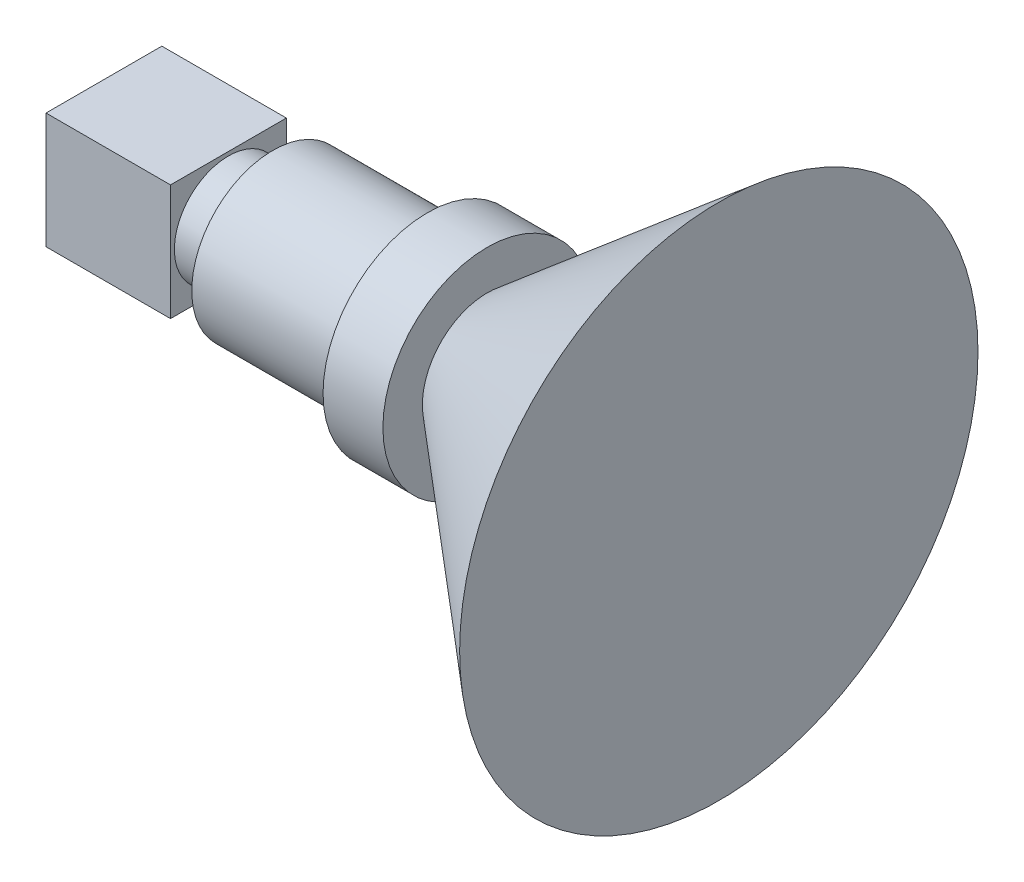
ISO-10303-21;
HEADER;
FILE_DESCRIPTION(('STEP AP214'),'2;1');
FILE_NAME('part.step','',(''),(''),'','','');
FILE_SCHEMA(('AUTOMOTIVE_DESIGN { 1 0 10303 214 1 1 1 1 }'));
ENDSEC;
DATA;
#1=APPLICATION_CONTEXT('core data for automotive mechanical design processes');
#2=APPLICATION_PROTOCOL_DEFINITION('international standard','automotive_design',2000,#1);
#3=PRODUCT_CONTEXT('',#1,'mechanical');
#4=PRODUCT('Part','Part','',(#3));
#5=PRODUCT_RELATED_PRODUCT_CATEGORY('part','',(#4));
#6=PRODUCT_DEFINITION_FORMATION('','',#4);
#7=PRODUCT_DEFINITION_CONTEXT('part definition',#1,'design');
#8=PRODUCT_DEFINITION('design','',#6,#7);
#9=PRODUCT_DEFINITION_SHAPE('','',#8);
#10=(LENGTH_UNIT() NAMED_UNIT(*) SI_UNIT(.MILLI.,.METRE.));
#11=(NAMED_UNIT(*) PLANE_ANGLE_UNIT() SI_UNIT($,.RADIAN.));
#12=(NAMED_UNIT(*) SI_UNIT($,.STERADIAN.) SOLID_ANGLE_UNIT());
#13=UNCERTAINTY_MEASURE_WITH_UNIT(LENGTH_MEASURE(1.E-05),#10,'distance_accuracy_value','');
#14=(GEOMETRIC_REPRESENTATION_CONTEXT(3) GLOBAL_UNCERTAINTY_ASSIGNED_CONTEXT((#13)) GLOBAL_UNIT_ASSIGNED_CONTEXT((#10,
#11,#12)) REPRESENTATION_CONTEXT('',''));
#15=CARTESIAN_POINT('',(0.,0.,0.));
#16=DIRECTION('',(0.,0.,1.));
#17=DIRECTION('',(1.,0.,0.));
#18=AXIS2_PLACEMENT_3D('',#15,#16,#17);
#19=CARTESIAN_POINT('',(16.125,15.,15.));
#20=DIRECTION('',(-1.,0.,0.));
#21=DIRECTION('',(0.,0.,1.));
#22=AXIS2_PLACEMENT_3D('',#19,#20,#21);
#23=PLANE('',#22);
#24=CARTESIAN_POINT('',(16.125,0.,0.));
#25=DIRECTION('',(1.,0.,0.));
#26=DIRECTION('',(0.,0.,-1.));
#27=AXIS2_PLACEMENT_3D('',#24,#25,#26);
#28=CIRCLE('',#27,14.);
#29=CARTESIAN_POINT('',(16.125,0.,-14.));
#30=VERTEX_POINT('',#29);
#31=EDGE_CURVE('E11',#30,#30,#28,.T.);
#32=ORIENTED_EDGE('',*,*,#31,.F.);
#33=EDGE_LOOP('',(#32));
#34=FACE_BOUND('',#33,.T.);
#35=DIRECTION('',(0.,0.,-1.));
#36=VECTOR('',#35,1.);
#37=CARTESIAN_POINT('',(16.125,-15.,15.));
#38=LINE('',#37,#36);
#39=CARTESIAN_POINT('',(16.125,-15.,15.));
#40=VERTEX_POINT('',#39);
#41=CARTESIAN_POINT('',(16.125,-15.,-15.));
#42=VERTEX_POINT('',#41);
#43=EDGE_CURVE('E129',#40,#42,#38,.T.);
#44=ORIENTED_EDGE('',*,*,#43,.T.);
#45=DIRECTION('',(0.,-1.,0.));
#46=VECTOR('',#45,1.);
#47=CARTESIAN_POINT('',(16.125,15.,-15.));
#48=LINE('',#47,#46);
#49=CARTESIAN_POINT('',(16.125,15.,-15.));
#50=VERTEX_POINT('',#49);
#51=EDGE_CURVE('E52',#50,#42,#48,.T.);
#52=ORIENTED_EDGE('',*,*,#51,.F.);
#53=DIRECTION('',(0.,0.,-1.));
#54=VECTOR('',#53,1.);
#55=CARTESIAN_POINT('',(16.125,15.,15.));
#56=LINE('',#55,#54);
#57=CARTESIAN_POINT('',(16.125,15.,15.));
#58=VERTEX_POINT('',#57);
#59=EDGE_CURVE('E131',#58,#50,#56,.T.);
#60=ORIENTED_EDGE('',*,*,#59,.F.);
#61=DIRECTION('',(0.,-1.,0.));
#62=VECTOR('',#61,1.);
#63=CARTESIAN_POINT('',(16.125,15.,15.));
#64=LINE('',#63,#62);
#65=EDGE_CURVE('E137',#58,#40,#64,.T.);
#66=ORIENTED_EDGE('',*,*,#65,.T.);
#67=EDGE_LOOP('',(#44,#52,#60,#66));
#68=FACE_BOUND('',#67,.T.);
#69=ADVANCED_FACE('F43',(#34,#68),#23,.F.);
#70=CARTESIAN_POINT('',(-16.125,15.,-15.));
#71=DIRECTION('',(0.,0.,1.));
#72=DIRECTION('',(1.,0.,0.));
#73=AXIS2_PLACEMENT_3D('',#70,#71,#72);
#74=PLANE('',#73);
#75=DIRECTION('',(-1.,0.,0.));
#76=VECTOR('',#75,1.);
#77=CARTESIAN_POINT('',(-16.125,-15.,-15.));
#78=LINE('',#77,#76);
#79=CARTESIAN_POINT('',(-16.125,-15.,-15.));
#80=VERTEX_POINT('',#79);
#81=EDGE_CURVE('E140',#42,#80,#78,.T.);
#82=ORIENTED_EDGE('',*,*,#81,.T.);
#83=DIRECTION('',(0.,-1.,0.));
#84=VECTOR('',#83,1.);
#85=CARTESIAN_POINT('',(-16.125,15.,-15.));
#86=LINE('',#85,#84);
#87=CARTESIAN_POINT('',(-16.125,15.,-15.));
#88=VERTEX_POINT('',#87);
#89=EDGE_CURVE('E147',#88,#80,#86,.T.);
#90=ORIENTED_EDGE('',*,*,#89,.F.);
#91=DIRECTION('',(-1.,0.,0.));
#92=VECTOR('',#91,1.);
#93=CARTESIAN_POINT('',(-16.125,15.,-15.));
#94=LINE('',#93,#92);
#95=EDGE_CURVE('E93',#50,#88,#94,.T.);
#96=ORIENTED_EDGE('',*,*,#95,.F.);
#97=ORIENTED_EDGE('',*,*,#51,.T.);
#98=EDGE_LOOP('',(#82,#90,#96,#97));
#99=FACE_BOUND('',#98,.T.);
#100=ADVANCED_FACE('F149',(#99),#74,.F.);
#101=CARTESIAN_POINT('',(-16.125,15.,15.));
#102=DIRECTION('',(1.,0.,0.));
#103=DIRECTION('',(0.,0.,-1.));
#104=AXIS2_PLACEMENT_3D('',#101,#102,#103);
#105=PLANE('',#104);
#106=DIRECTION('',(0.,0.,1.));
#107=VECTOR('',#106,1.);
#108=CARTESIAN_POINT('',(-16.125,-15.,15.));
#109=LINE('',#108,#107);
#110=CARTESIAN_POINT('',(-16.125,-15.,15.));
#111=VERTEX_POINT('',#110);
#112=EDGE_CURVE('E79',#80,#111,#109,.T.);
#113=ORIENTED_EDGE('',*,*,#112,.T.);
#114=DIRECTION('',(0.,-1.,0.));
#115=VECTOR('',#114,1.);
#116=CARTESIAN_POINT('',(-16.125,15.,15.));
#117=LINE('',#116,#115);
#118=CARTESIAN_POINT('',(-16.125,15.,15.));
#119=VERTEX_POINT('',#118);
#120=EDGE_CURVE('E145',#119,#111,#117,.T.);
#121=ORIENTED_EDGE('',*,*,#120,.F.);
#122=DIRECTION('',(0.,0.,1.));
#123=VECTOR('',#122,1.);
#124=CARTESIAN_POINT('',(-16.125,15.,15.));
#125=LINE('',#124,#123);
#126=EDGE_CURVE('E134',#88,#119,#125,.T.);
#127=ORIENTED_EDGE('',*,*,#126,.F.);
#128=ORIENTED_EDGE('',*,*,#89,.T.);
#129=EDGE_LOOP('',(#113,#121,#127,#128));
#130=FACE_BOUND('',#129,.T.);
#131=ADVANCED_FACE('F177',(#130),#105,.F.);
#132=CARTESIAN_POINT('',(-16.125,15.,15.));
#133=DIRECTION('',(0.,0.,-1.));
#134=DIRECTION('',(-1.,0.,0.));
#135=AXIS2_PLACEMENT_3D('',#132,#133,#134);
#136=PLANE('',#135);
#137=DIRECTION('',(1.,0.,0.));
#138=VECTOR('',#137,1.);
#139=CARTESIAN_POINT('',(-16.125,-15.,15.));
#140=LINE('',#139,#138);
#141=EDGE_CURVE('E85',#111,#40,#140,.T.);
#142=ORIENTED_EDGE('',*,*,#141,.T.);
#143=ORIENTED_EDGE('',*,*,#65,.F.);
#144=DIRECTION('',(1.,0.,0.));
#145=VECTOR('',#144,1.);
#146=CARTESIAN_POINT('',(-16.125,15.,15.));
#147=LINE('',#146,#145);
#148=EDGE_CURVE('E61',#119,#58,#147,.T.);
#149=ORIENTED_EDGE('',*,*,#148,.F.);
#150=ORIENTED_EDGE('',*,*,#120,.T.);
#151=EDGE_LOOP('',(#142,#143,#149,#150));
#152=FACE_BOUND('',#151,.T.);
#153=ADVANCED_FACE('F168',(#152),#136,.F.);
#154=CARTESIAN_POINT('',(0.,15.,0.));
#155=DIRECTION('',(0.,-1.,0.));
#156=DIRECTION('',(0.,0.,-1.));
#157=AXIS2_PLACEMENT_3D('',#154,#155,#156);
#158=PLANE('',#157);
#159=ORIENTED_EDGE('',*,*,#59,.T.);
#160=ORIENTED_EDGE('',*,*,#95,.T.);
#161=ORIENTED_EDGE('',*,*,#126,.T.);
#162=ORIENTED_EDGE('',*,*,#148,.T.);
#163=EDGE_LOOP('',(#159,#160,#161,#162));
#164=FACE_BOUND('',#163,.T.);
#165=ADVANCED_FACE('F157',(#164),#158,.F.);
#166=CARTESIAN_POINT('',(0.,-15.,0.));
#167=DIRECTION('',(0.,-1.,0.));
#168=DIRECTION('',(0.,0.,-1.));
#169=AXIS2_PLACEMENT_3D('',#166,#167,#168);
#170=PLANE('',#169);
#171=CARTESIAN_POINT('',(-12.125,-15.,0.));
#172=DIRECTION('',(0.,-1.,0.));
#173=DIRECTION('',(0.,0.,-1.));
#174=AXIS2_PLACEMENT_3D('',#171,#172,#173);
#175=CIRCLE('',#174,2.55269999999999);
#176=CARTESIAN_POINT('',(-12.125,-15.,-2.55269999999999));
#177=VERTEX_POINT('',#176);
#178=EDGE_CURVE('E108',#177,#177,#175,.T.);
#179=ORIENTED_EDGE('',*,*,#178,.F.);
#180=EDGE_LOOP('',(#179));
#181=FACE_BOUND('',#180,.T.);
#182=ORIENTED_EDGE('',*,*,#43,.F.);
#183=ORIENTED_EDGE('',*,*,#141,.F.);
#184=ORIENTED_EDGE('',*,*,#112,.F.);
#185=ORIENTED_EDGE('',*,*,#81,.F.);
#186=EDGE_LOOP('',(#182,#183,#184,#185));
#187=FACE_BOUND('',#186,.T.);
#188=ADVANCED_FACE('F154',(#181,#187),#170,.T.);
#189=CARTESIAN_POINT('',(27.625,0.,0.));
#190=DIRECTION('',(-1.,0.,0.));
#191=DIRECTION('',(0.,0.,1.));
#192=AXIS2_PLACEMENT_3D('',#189,#190,#191);
#193=CYLINDRICAL_SURFACE('',#192,14.);
#194=CARTESIAN_POINT('',(27.625,0.,0.));
#195=DIRECTION('',(1.,0.,0.));
#196=DIRECTION('',(0.,0.,-1.));
#197=AXIS2_PLACEMENT_3D('',#194,#195,#196);
#198=CIRCLE('',#197,14.);
#199=CARTESIAN_POINT('',(27.625,0.,-14.));
#200=VERTEX_POINT('',#199);
#201=EDGE_CURVE('E125',#200,#200,#198,.T.);
#202=ORIENTED_EDGE('',*,*,#201,.F.);
#203=EDGE_LOOP('',(#202));
#204=FACE_BOUND('',#203,.T.);
#205=ORIENTED_EDGE('',*,*,#31,.T.);
#206=EDGE_LOOP('',(#205));
#207=FACE_BOUND('',#206,.T.);
#208=ADVANCED_FACE('F156',(#204,#207),#193,.T.);
#209=CARTESIAN_POINT('',(67.625,0.,0.));
#210=DIRECTION('',(-1.,0.,0.));
#211=DIRECTION('',(0.,0.,1.));
#212=AXIS2_PLACEMENT_3D('',#209,#210,#211);
#213=CYLINDRICAL_SURFACE('',#212,21.);
#214=CARTESIAN_POINT('',(67.625,0.,0.));
#215=DIRECTION('',(1.,0.,0.));
#216=DIRECTION('',(0.,0.,-1.));
#217=AXIS2_PLACEMENT_3D('',#214,#215,#216);
#218=CIRCLE('',#217,21.);
#219=CARTESIAN_POINT('',(67.625,0.,-21.));
#220=VERTEX_POINT('',#219);
#221=EDGE_CURVE('E122',#220,#220,#218,.T.);
#222=ORIENTED_EDGE('',*,*,#221,.F.);
#223=EDGE_LOOP('',(#222));
#224=FACE_BOUND('',#223,.T.);
#225=CARTESIAN_POINT('',(27.625,0.,0.));
#226=DIRECTION('',(1.,0.,0.));
#227=DIRECTION('',(0.,0.,-1.));
#228=AXIS2_PLACEMENT_3D('',#225,#226,#227);
#229=CIRCLE('',#228,21.);
#230=CARTESIAN_POINT('',(27.625,0.,-21.));
#231=VERTEX_POINT('',#230);
#232=EDGE_CURVE('E118',#231,#231,#229,.T.);
#233=ORIENTED_EDGE('',*,*,#232,.T.);
#234=EDGE_LOOP('',(#233));
#235=FACE_BOUND('',#234,.T.);
#236=ADVANCED_FACE('F164',(#224,#235),#213,.T.);
#237=CARTESIAN_POINT('',(27.625,0.,0.));
#238=DIRECTION('',(1.,0.,0.));
#239=DIRECTION('',(0.,0.,-1.));
#240=AXIS2_PLACEMENT_3D('',#237,#238,#239);
#241=PLANE('',#240);
#242=ORIENTED_EDGE('',*,*,#201,.T.);
#243=EDGE_LOOP('',(#242));
#244=FACE_BOUND('',#243,.T.);
#245=ORIENTED_EDGE('',*,*,#232,.F.);
#246=EDGE_LOOP('',(#245));
#247=FACE_BOUND('',#246,.T.);
#248=ADVANCED_FACE('F214',(#244,#247),#241,.F.);
#249=CARTESIAN_POINT('',(83.125,0.,0.));
#250=DIRECTION('',(-1.,0.,0.));
#251=DIRECTION('',(0.,0.,1.));
#252=AXIS2_PLACEMENT_3D('',#249,#250,#251);
#253=CYLINDRICAL_SURFACE('',#252,27.);
#254=CARTESIAN_POINT('',(83.125,0.,0.));
#255=DIRECTION('',(1.,0.,0.));
#256=DIRECTION('',(0.,0.,-1.));
#257=AXIS2_PLACEMENT_3D('',#254,#255,#256);
#258=CIRCLE('',#257,27.);
#259=CARTESIAN_POINT('',(83.125,0.,-27.));
#260=VERTEX_POINT('',#259);
#261=EDGE_CURVE('E115',#260,#260,#258,.T.);
#262=ORIENTED_EDGE('',*,*,#261,.F.);
#263=EDGE_LOOP('',(#262));
#264=FACE_BOUND('',#263,.T.);
#265=CARTESIAN_POINT('',(67.625,0.,0.));
#266=DIRECTION('',(1.,0.,0.));
#267=DIRECTION('',(0.,0.,-1.));
#268=AXIS2_PLACEMENT_3D('',#265,#266,#267);
#269=CIRCLE('',#268,27.);
#270=CARTESIAN_POINT('',(67.625,0.,-27.));
#271=VERTEX_POINT('',#270);
#272=EDGE_CURVE('E119',#271,#271,#269,.T.);
#273=ORIENTED_EDGE('',*,*,#272,.T.);
#274=EDGE_LOOP('',(#273));
#275=FACE_BOUND('',#274,.T.);
#276=ADVANCED_FACE('F224',(#264,#275),#253,.T.);
#277=CARTESIAN_POINT('',(83.125,0.,0.));
#278=DIRECTION('',(1.,0.,0.));
#279=DIRECTION('',(0.,0.,-1.));
#280=AXIS2_PLACEMENT_3D('',#277,#278,#279);
#281=PLANE('',#280);
#282=CARTESIAN_POINT('',(83.125,0.,0.));
#283=DIRECTION('',(1.,0.,0.));
#284=DIRECTION('',(0.,0.,-1.));
#285=AXIS2_PLACEMENT_3D('',#282,#283,#284);
#286=CIRCLE('',#285,16.7819926235456);
#287=CARTESIAN_POINT('',(83.125,0.,-16.7819926235456));
#288=VERTEX_POINT('',#287);
#289=EDGE_CURVE('E46',#288,#288,#286,.F.);
#290=ORIENTED_EDGE('',*,*,#289,.T.);
#291=EDGE_LOOP('',(#290));
#292=FACE_BOUND('',#291,.T.);
#293=ORIENTED_EDGE('',*,*,#261,.T.);
#294=EDGE_LOOP('',(#293));
#295=FACE_BOUND('',#294,.T.);
#296=ADVANCED_FACE('F234',(#292,#295),#281,.T.);
#297=CARTESIAN_POINT('',(67.625,0.,0.));
#298=DIRECTION('',(1.,0.,0.));
#299=DIRECTION('',(0.,0.,-1.));
#300=AXIS2_PLACEMENT_3D('',#297,#298,#299);
#301=PLANE('',#300);
#302=ORIENTED_EDGE('',*,*,#221,.T.);
#303=EDGE_LOOP('',(#302));
#304=FACE_BOUND('',#303,.T.);
#305=ORIENTED_EDGE('',*,*,#272,.F.);
#306=EDGE_LOOP('',(#305));
#307=FACE_BOUND('',#306,.T.);
#308=ADVANCED_FACE('F245',(#304,#307),#301,.F.);
#309=CARTESIAN_POINT('',(143.125,0.,0.));
#310=DIRECTION('',(-1.,0.,0.));
#311=DIRECTION('',(0.,0.,1.));
#312=AXIS2_PLACEMENT_3D('',#309,#310,#311);
#313=PLANE('',#312);
#314=CARTESIAN_POINT('',(143.125,0.,0.));
#315=DIRECTION('',(-1.,0.,0.));
#316=DIRECTION('',(0.,0.,1.));
#317=AXIS2_PLACEMENT_3D('',#314,#315,#316);
#318=CIRCLE('',#317,67.1279704941822);
#319=CARTESIAN_POINT('',(143.125,0.,-67.1279704941822));
#320=VERTEX_POINT('',#319);
#321=EDGE_CURVE('E107',#320,#320,#318,.T.);
#322=ORIENTED_EDGE('',*,*,#321,.F.);
#323=EDGE_LOOP('',(#322));
#324=FACE_BOUND('',#323,.T.);
#325=ADVANCED_FACE('F255',(#324),#313,.F.);
#326=CARTESIAN_POINT('',(143.125,0.,0.));
#327=DIRECTION('',(1.,0.,0.));
#328=DIRECTION('',(0.,0.,-1.));
#329=AXIS2_PLACEMENT_3D('',#326,#327,#328);
#330=CONICAL_SURFACE('',#329,67.1279704941822,0.69813170079773);
#331=CARTESIAN_POINT('',(83.125,0.,-16.7819926235456));
#332=CARTESIAN_POINT('',(83.75,0.,-17.3064298930314));
#333=CARTESIAN_POINT('',(84.375,0.,-17.8308671625172));
#334=CARTESIAN_POINT('',(85.625,0.,-18.8797417014888));
#335=CARTESIAN_POINT('',(86.25,0.,-19.4041789709746));
#336=CARTESIAN_POINT('',(87.5,0.,-20.4530535099462));
#337=CARTESIAN_POINT('',(88.125,0.,-20.977490779432));
#338=CARTESIAN_POINT('',(89.375,0.,-22.0263653184036));
#339=CARTESIAN_POINT('',(90.,0.,-22.5508025878894));
#340=CARTESIAN_POINT('',(91.25,0.,-23.599677126861));
#341=CARTESIAN_POINT('',(91.875,0.,-24.1241143963467));
#342=CARTESIAN_POINT('',(93.125,0.,-25.1729889353183));
#343=CARTESIAN_POINT('',(93.75,0.,-25.6974262048041));
#344=CARTESIAN_POINT('',(95.,0.,-26.7463007437757));
#345=CARTESIAN_POINT('',(95.625,0.,-27.2707380132615));
#346=CARTESIAN_POINT('',(96.875,0.,-28.3196125522331));
#347=CARTESIAN_POINT('',(97.5,0.,-28.8440498217189));
#348=CARTESIAN_POINT('',(98.75,0.,-29.8929243606905));
#349=CARTESIAN_POINT('',(99.375,0.,-30.4173616301763));
#350=CARTESIAN_POINT('',(100.625,0.,-31.4662361691479));
#351=CARTESIAN_POINT('',(101.25,0.,-31.9906734386337));
#352=CARTESIAN_POINT('',(102.5,0.,-33.0395479776053));
#353=CARTESIAN_POINT('',(103.125,0.,-33.5639852470911));
#354=CARTESIAN_POINT('',(104.375,0.,-34.6128597860627));
#355=CARTESIAN_POINT('',(105.,0.,-35.1372970555485));
#356=CARTESIAN_POINT('',(106.25,0.,-36.1861715945201));
#357=CARTESIAN_POINT('',(106.875,0.,-36.7106088640059));
#358=CARTESIAN_POINT('',(108.125,0.,-37.7594834029775));
#359=CARTESIAN_POINT('',(108.75,0.,-38.2839206724633));
#360=CARTESIAN_POINT('',(110.,0.,-39.3327952114349));
#361=CARTESIAN_POINT('',(110.625,0.,-39.8572324809207));
#362=CARTESIAN_POINT('',(111.875,0.,-40.9061070198923));
#363=CARTESIAN_POINT('',(112.5,0.,-41.4305442893781));
#364=CARTESIAN_POINT('',(113.75,0.,-42.4794188283497));
#365=CARTESIAN_POINT('',(114.375,0.,-43.0038560978355));
#366=CARTESIAN_POINT('',(115.625,0.,-44.0527306368071));
#367=CARTESIAN_POINT('',(116.25,0.,-44.5771679062929));
#368=CARTESIAN_POINT('',(117.5,0.,-45.6260424452645));
#369=CARTESIAN_POINT('',(118.125,0.,-46.1504797147503));
#370=CARTESIAN_POINT('',(119.375,0.,-47.1993542537219));
#371=CARTESIAN_POINT('',(120.,0.,-47.7237915232077));
#372=CARTESIAN_POINT('',(121.25,0.,-48.7726660621793));
#373=CARTESIAN_POINT('',(121.875,0.,-49.2971033316651));
#374=CARTESIAN_POINT('',(123.125,0.,-50.3459778706367));
#375=CARTESIAN_POINT('',(123.75,0.,-50.8704151401225));
#376=CARTESIAN_POINT('',(125.,0.,-51.9192896790941));
#377=CARTESIAN_POINT('',(125.625,0.,-52.4437269485799));
#378=CARTESIAN_POINT('',(126.875,0.,-53.4926014875515));
#379=CARTESIAN_POINT('',(127.5,0.,-54.0170387570373));
#380=CARTESIAN_POINT('',(128.75,0.,-55.0659132960089));
#381=CARTESIAN_POINT('',(129.375,0.,-55.5903505654947));
#382=CARTESIAN_POINT('',(130.625,0.,-56.6392251044663));
#383=CARTESIAN_POINT('',(131.25,0.,-57.1636623739521));
#384=CARTESIAN_POINT('',(132.5,0.,-58.2125369129237));
#385=CARTESIAN_POINT('',(133.125,0.,-58.7369741824095));
#386=CARTESIAN_POINT('',(134.375,0.,-59.7858487213811));
#387=CARTESIAN_POINT('',(135.,0.,-60.3102859908668));
#388=CARTESIAN_POINT('',(136.25,0.,-61.3591605298384));
#389=CARTESIAN_POINT('',(136.875,0.,-61.8835977993242));
#390=CARTESIAN_POINT('',(138.125,0.,-62.9324723382958));
#391=CARTESIAN_POINT('',(138.75,0.,-63.4569096077816));
#392=CARTESIAN_POINT('',(140.,0.,-64.5057841467532));
#393=CARTESIAN_POINT('',(140.625,0.,-65.030221416239));
#394=CARTESIAN_POINT('',(141.875,0.,-66.0790959552106));
#395=CARTESIAN_POINT('',(142.5,0.,-66.6035332246964));
#396=CARTESIAN_POINT('',(143.125,0.,-67.1279704941822));
#397=B_SPLINE_CURVE_WITH_KNOTS('',3,(#331,#332,#333,#334,#335,#336,#337,#338,#339,#340,#341,
#342,#343,#344,#345,#346,#347,#348,#349,#350,#351,#352,#353,#354,#355,#356,#357,#358,#359,#360,
#361,#362,#363,#364,#365,#366,#367,#368,#369,#370,#371,#372,#373,#374,#375,#376,#377,#378,#379,
#380,#381,#382,#383,#384,#385,#386,#387,#388,#389,#390,#391,#392,#393,#394,#395,#396),
.UNSPECIFIED.,.F.,.F.,(4,2,2,2,2,2,2,2,2,2,2,2,2,2,2,2,2,2,2,2,2,2,2,2,2,2,2,2,2,2,2,2,4),(0.,
2.44763866749802,4.89527733499604,7.34291600249406,9.79055466999209,12.2381933374901,
14.6858320049881,17.1334706724861,19.5811093399842,22.0287480074822,24.4763866749802,
26.9240253424782,29.3716640099762,31.8193026774743,34.2669413449723,36.7145800124703,
39.1622186799683,41.6098573474663,44.0574960149644,46.5051346824624,48.9527733499604,
51.4004120174584,53.8480506849565,56.2956893524545,58.7433280199525,61.1909666874505,
63.6386053549485,66.0862440224466,68.5338826899446,70.9815213574426,73.4291600249406,
75.8767986924386,78.3244373599367),.UNSPECIFIED.);
#398=EDGE_CURVE('BSEAM101',#288,#320,#397,.T.);
#399=ORIENTED_EDGE('',*,*,#289,.F.);
#400=ORIENTED_EDGE('',*,*,#321,.T.);
#401=ORIENTED_EDGE('',*,*,#398,.T.);
#402=ORIENTED_EDGE('',*,*,#398,.F.);
#403=EDGE_LOOP('',(#399,#401,#400,#402));
#404=FACE_BOUND('',#403,.T.);
#405=ADVANCED_FACE('F101',(#404),#330,.T.);
#406=CARTESIAN_POINT('',(-12.125,-10.24,0.));
#407=DIRECTION('',(0.,-1.,0.));
#408=DIRECTION('',(0.,0.,-1.));
#409=AXIS2_PLACEMENT_3D('',#406,#407,#408);
#410=CONICAL_SURFACE('',#409,2.55269999999999,1.02974425867665);
#411=CARTESIAN_POINT('',(-12.125,-8.70618309780835,0.));
#412=VERTEX_POINT('',#411);
#413=VERTEX_LOOP('',#412);
#414=FACE_BOUND('',#413,.T.);
#415=CARTESIAN_POINT('',(-12.125,-10.24,0.));
#416=DIRECTION('',(0.,-1.,0.));
#417=DIRECTION('',(0.,0.,-1.));
#418=AXIS2_PLACEMENT_3D('',#415,#416,#417);
#419=CIRCLE('',#418,2.55269999999999);
#420=CARTESIAN_POINT('',(-12.125,-10.24,-2.55269999999999));
#421=VERTEX_POINT('',#420);
#422=EDGE_CURVE('E105',#421,#421,#419,.T.);
#423=ORIENTED_EDGE('',*,*,#422,.T.);
#424=EDGE_LOOP('',(#423));
#425=FACE_BOUND('',#424,.T.);
#426=ADVANCED_FACE('F97',(#414,#425),#410,.F.);
#427=CARTESIAN_POINT('',(-12.125,-15.,0.));
#428=DIRECTION('',(0.,-1.,0.));
#429=DIRECTION('',(0.,0.,-1.));
#430=AXIS2_PLACEMENT_3D('',#427,#428,#429);
#431=CYLINDRICAL_SURFACE('',#430,2.55269999999999);
#432=ORIENTED_EDGE('',*,*,#422,.F.);
#433=EDGE_LOOP('',(#432));
#434=FACE_BOUND('',#433,.T.);
#435=ORIENTED_EDGE('',*,*,#178,.T.);
#436=EDGE_LOOP('',(#435));
#437=FACE_BOUND('',#436,.T.);
#438=ADVANCED_FACE('F100',(#434,#437),#431,.F.);
#439=CLOSED_SHELL('',(#69,#100,#131,#153,#165,#188,#208,#236,#248,#276,#296,#308,#325,#405,#426,#438));
#440=MANIFOLD_SOLID_BREP('B2',#439);
#441=ADVANCED_BREP_SHAPE_REPRESENTATION('',(#18,#440),#14);
#442=SHAPE_DEFINITION_REPRESENTATION(#9,#441);
ENDSEC;
END-ISO-10303-21;
